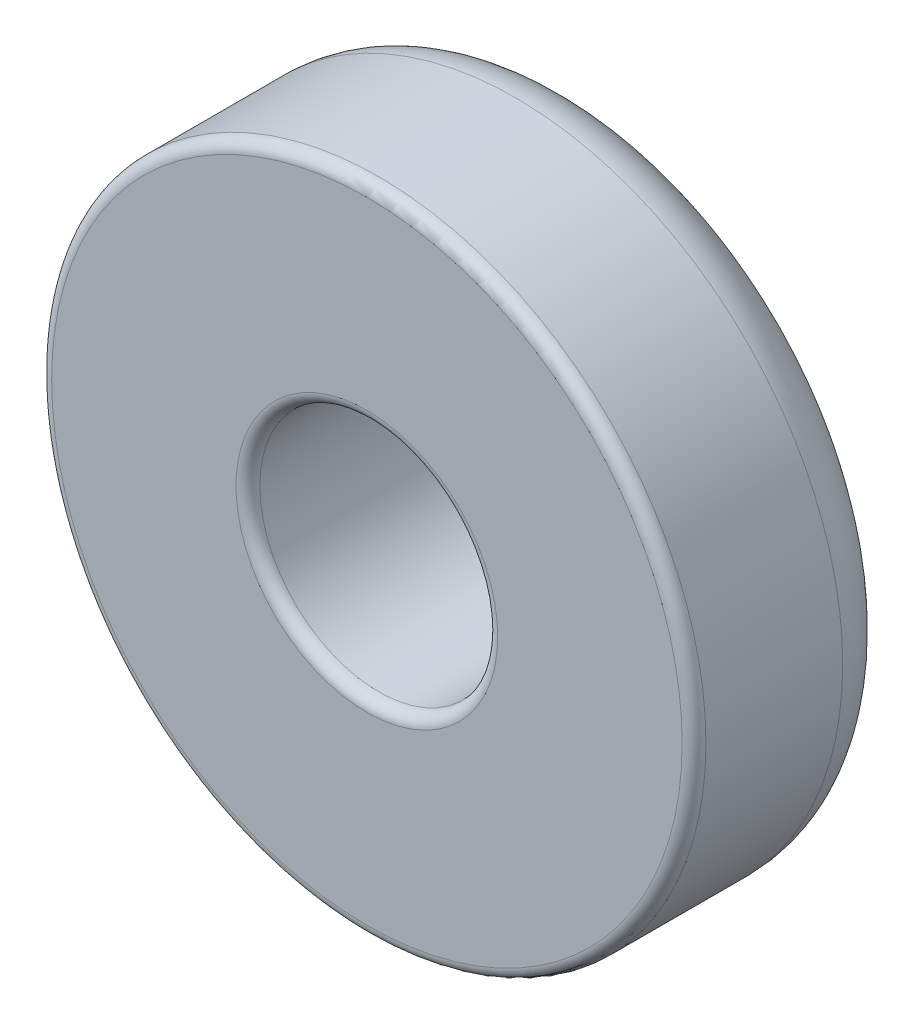
ISO-10303-21;
HEADER;
FILE_DESCRIPTION(('STEP AP214'),'2;1');
FILE_NAME('part.step','',(''),(''),'','','');
FILE_SCHEMA(('AUTOMOTIVE_DESIGN { 1 0 10303 214 1 1 1 1 }'));
ENDSEC;
DATA;
#1=APPLICATION_CONTEXT('core data for automotive mechanical design processes');
#2=APPLICATION_PROTOCOL_DEFINITION('international standard','automotive_design',2000,#1);
#3=PRODUCT_CONTEXT('',#1,'mechanical');
#4=PRODUCT('Part','Part','',(#3));
#5=PRODUCT_RELATED_PRODUCT_CATEGORY('part','',(#4));
#6=PRODUCT_DEFINITION_FORMATION('','',#4);
#7=PRODUCT_DEFINITION_CONTEXT('part definition',#1,'design');
#8=PRODUCT_DEFINITION('design','',#6,#7);
#9=PRODUCT_DEFINITION_SHAPE('','',#8);
#10=(LENGTH_UNIT() NAMED_UNIT(*) SI_UNIT(.MILLI.,.METRE.));
#11=(NAMED_UNIT(*) PLANE_ANGLE_UNIT() SI_UNIT($,.RADIAN.));
#12=(NAMED_UNIT(*) SI_UNIT($,.STERADIAN.) SOLID_ANGLE_UNIT());
#13=UNCERTAINTY_MEASURE_WITH_UNIT(LENGTH_MEASURE(1.E-05),#10,'distance_accuracy_value','');
#14=(GEOMETRIC_REPRESENTATION_CONTEXT(3) GLOBAL_UNCERTAINTY_ASSIGNED_CONTEXT((#13)) GLOBAL_UNIT_ASSIGNED_CONTEXT((#10,
#11,#12)) REPRESENTATION_CONTEXT('',''));
#15=CARTESIAN_POINT('',(0.,0.,0.));
#16=DIRECTION('',(0.,0.,1.));
#17=DIRECTION('',(1.,0.,0.));
#18=AXIS2_PLACEMENT_3D('',#15,#16,#17);
#19=CARTESIAN_POINT('',(0.,0.,1.75));
#20=DIRECTION('',(0.,0.,1.));
#21=DIRECTION('',(1.,0.,0.));
#22=AXIS2_PLACEMENT_3D('',#19,#20,#21);
#23=PLANE('',#22);
#24=CARTESIAN_POINT('',(0.,0.,1.75));
#25=DIRECTION('',(0.,0.,1.));
#26=DIRECTION('',(1.,0.,0.));
#27=AXIS2_PLACEMENT_3D('',#24,#25,#26);
#28=CIRCLE('',#27,2.65);
#29=CARTESIAN_POINT('',(2.65,0.,1.75));
#30=VERTEX_POINT('',#29);
#31=EDGE_CURVE('E51',#30,#30,#28,.T.);
#32=ORIENTED_EDGE('',*,*,#31,.T.);
#33=EDGE_LOOP('',(#32));
#34=FACE_BOUND('',#33,.T.);
#35=CARTESIAN_POINT('',(0.,0.,1.75));
#36=DIRECTION('',(0.,0.,1.));
#37=DIRECTION('',(1.,0.,0.));
#38=AXIS2_PLACEMENT_3D('',#35,#36,#37);
#39=CIRCLE('',#38,1.1);
#40=CARTESIAN_POINT('',(1.1,0.,1.75));
#41=VERTEX_POINT('',#40);
#42=EDGE_CURVE('E56',#41,#41,#39,.F.);
#43=ORIENTED_EDGE('',*,*,#42,.T.);
#44=EDGE_LOOP('',(#43));
#45=FACE_BOUND('',#44,.T.);
#46=ADVANCED_FACE('F43',(#34,#45),#23,.T.);
#47=CARTESIAN_POINT('',(0.,0.,0.));
#48=DIRECTION('',(0.,0.,1.));
#49=DIRECTION('',(1.,0.,0.));
#50=AXIS2_PLACEMENT_3D('',#47,#48,#49);
#51=PLANE('',#50);
#52=CARTESIAN_POINT('',(0.,0.,0.));
#53=DIRECTION('',(0.,0.,1.));
#54=DIRECTION('',(1.,0.,0.));
#55=AXIS2_PLACEMENT_3D('',#52,#53,#54);
#56=CIRCLE('',#55,1.1);
#57=CARTESIAN_POINT('',(1.1,0.,0.));
#58=VERTEX_POINT('',#57);
#59=EDGE_CURVE('E71',#58,#58,#56,.T.);
#60=ORIENTED_EDGE('',*,*,#59,.T.);
#61=EDGE_LOOP('',(#60));
#62=FACE_BOUND('',#61,.T.);
#63=CARTESIAN_POINT('',(0.,0.,0.));
#64=DIRECTION('',(0.,0.,1.));
#65=DIRECTION('',(1.,0.,0.));
#66=AXIS2_PLACEMENT_3D('',#63,#64,#65);
#67=CIRCLE('',#66,2.25);
#68=CARTESIAN_POINT('',(2.25,0.,0.));
#69=VERTEX_POINT('',#68);
#70=EDGE_CURVE('E75',#69,#69,#67,.F.);
#71=ORIENTED_EDGE('',*,*,#70,.T.);
#72=EDGE_LOOP('',(#71));
#73=FACE_BOUND('',#72,.T.);
#74=ADVANCED_FACE('F104',(#62,#73),#51,.F.);
#75=CARTESIAN_POINT('',(0.,0.,1.75));
#76=DIRECTION('',(0.,0.,-1.));
#77=DIRECTION('',(-1.,0.,0.));
#78=AXIS2_PLACEMENT_3D('',#75,#76,#77);
#79=CYLINDRICAL_SURFACE('',#78,2.75);
#80=CARTESIAN_POINT('',(0.,0.,1.65));
#81=DIRECTION('',(0.,0.,1.));
#82=DIRECTION('',(1.,0.,0.));
#83=AXIS2_PLACEMENT_3D('',#80,#81,#82);
#84=CIRCLE('',#83,2.75);
#85=CARTESIAN_POINT('',(2.75,0.,1.65));
#86=VERTEX_POINT('',#85);
#87=EDGE_CURVE('E11',#86,#86,#84,.F.);
#88=ORIENTED_EDGE('',*,*,#87,.T.);
#89=EDGE_LOOP('',(#88));
#90=FACE_BOUND('',#89,.T.);
#91=CARTESIAN_POINT('',(0.,0.,0.5));
#92=DIRECTION('',(0.,0.,1.));
#93=DIRECTION('',(1.,0.,0.));
#94=AXIS2_PLACEMENT_3D('',#91,#92,#93);
#95=CIRCLE('',#94,2.75);
#96=CARTESIAN_POINT('',(2.75,0.,0.5));
#97=VERTEX_POINT('',#96);
#98=EDGE_CURVE('E79',#97,#97,#95,.T.);
#99=ORIENTED_EDGE('',*,*,#98,.T.);
#100=EDGE_LOOP('',(#99));
#101=FACE_BOUND('',#100,.T.);
#102=ADVANCED_FACE('F84',(#90,#101),#79,.T.);
#103=CARTESIAN_POINT('',(0.,0.,1.75));
#104=DIRECTION('',(0.,0.,-1.));
#105=DIRECTION('',(-1.,0.,0.));
#106=AXIS2_PLACEMENT_3D('',#103,#104,#105);
#107=CYLINDRICAL_SURFACE('',#106,1.);
#108=CARTESIAN_POINT('',(0.,0.,0.1));
#109=DIRECTION('',(0.,0.,1.));
#110=DIRECTION('',(1.,0.,0.));
#111=AXIS2_PLACEMENT_3D('',#108,#109,#110);
#112=CIRCLE('',#111,1.);
#113=CARTESIAN_POINT('',(1.,0.,0.1));
#114=VERTEX_POINT('',#113);
#115=EDGE_CURVE('E61',#114,#114,#112,.F.);
#116=ORIENTED_EDGE('',*,*,#115,.T.);
#117=EDGE_LOOP('',(#116));
#118=FACE_BOUND('',#117,.T.);
#119=CARTESIAN_POINT('',(0.,0.,1.65));
#120=DIRECTION('',(0.,0.,1.));
#121=DIRECTION('',(1.,0.,0.));
#122=AXIS2_PLACEMENT_3D('',#119,#120,#121);
#123=CIRCLE('',#122,1.);
#124=CARTESIAN_POINT('',(1.,0.,1.65));
#125=VERTEX_POINT('',#124);
#126=EDGE_CURVE('E67',#125,#125,#123,.T.);
#127=ORIENTED_EDGE('',*,*,#126,.T.);
#128=EDGE_LOOP('',(#127));
#129=FACE_BOUND('',#128,.T.);
#130=ADVANCED_FACE('F89',(#118,#129),#107,.F.);
#131=CARTESIAN_POINT('',(0.,0.,0.5));
#132=DIRECTION('',(0.,0.,1.));
#133=DIRECTION('',(1.,0.,0.));
#134=AXIS2_PLACEMENT_3D('',#131,#132,#133);
#135=TOROIDAL_SURFACE('',#134,2.25,0.5);
#136=ORIENTED_EDGE('',*,*,#70,.F.);
#137=EDGE_LOOP('',(#136));
#138=FACE_BOUND('',#137,.T.);
#139=ORIENTED_EDGE('',*,*,#98,.F.);
#140=EDGE_LOOP('',(#139));
#141=FACE_BOUND('',#140,.T.);
#142=ADVANCED_FACE('F86',(#138,#141),#135,.T.);
#143=CARTESIAN_POINT('',(0.,0.,0.1));
#144=DIRECTION('',(0.,0.,1.));
#145=DIRECTION('',(1.,0.,0.));
#146=AXIS2_PLACEMENT_3D('',#143,#144,#145);
#147=TOROIDAL_SURFACE('',#146,1.1,0.1);
#148=ORIENTED_EDGE('',*,*,#115,.F.);
#149=EDGE_LOOP('',(#148));
#150=FACE_BOUND('',#149,.T.);
#151=ORIENTED_EDGE('',*,*,#59,.F.);
#152=EDGE_LOOP('',(#151));
#153=FACE_BOUND('',#152,.T.);
#154=ADVANCED_FACE('F88',(#150,#153),#147,.T.);
#155=CARTESIAN_POINT('',(0.,0.,1.65));
#156=DIRECTION('',(0.,0.,1.));
#157=DIRECTION('',(1.,0.,0.));
#158=AXIS2_PLACEMENT_3D('',#155,#156,#157);
#159=TOROIDAL_SURFACE('',#158,2.65,0.1);
#160=ORIENTED_EDGE('',*,*,#87,.F.);
#161=EDGE_LOOP('',(#160));
#162=FACE_BOUND('',#161,.T.);
#163=ORIENTED_EDGE('',*,*,#31,.F.);
#164=EDGE_LOOP('',(#163));
#165=FACE_BOUND('',#164,.T.);
#166=ADVANCED_FACE('F96',(#162,#165),#159,.T.);
#167=CARTESIAN_POINT('',(0.,0.,1.65));
#168=DIRECTION('',(0.,0.,1.));
#169=DIRECTION('',(1.,0.,0.));
#170=AXIS2_PLACEMENT_3D('',#167,#168,#169);
#171=TOROIDAL_SURFACE('',#170,1.1,0.1);
#172=ORIENTED_EDGE('',*,*,#42,.F.);
#173=EDGE_LOOP('',(#172));
#174=FACE_BOUND('',#173,.T.);
#175=ORIENTED_EDGE('',*,*,#126,.F.);
#176=EDGE_LOOP('',(#175));
#177=FACE_BOUND('',#176,.T.);
#178=ADVANCED_FACE('F45',(#174,#177),#171,.T.);
#179=CLOSED_SHELL('',(#46,#74,#102,#130,#142,#154,#166,#178));
#180=MANIFOLD_SOLID_BREP('B2',#179);
#181=ADVANCED_BREP_SHAPE_REPRESENTATION('',(#18,#180),#14);
#182=SHAPE_DEFINITION_REPRESENTATION(#9,#181);
ENDSEC;
END-ISO-10303-21;
